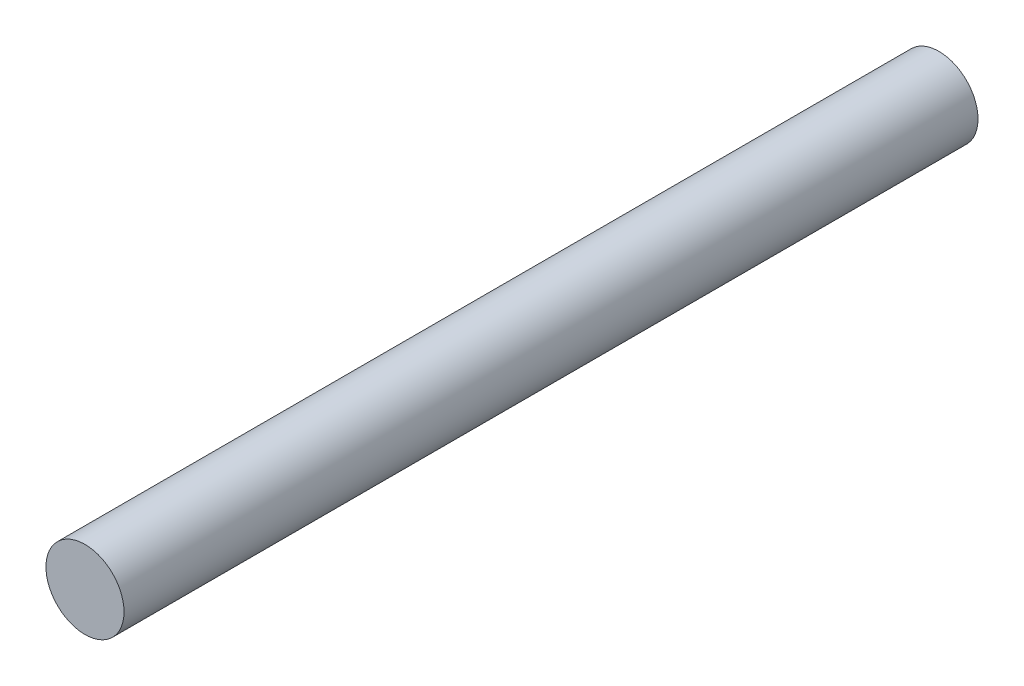
ISO-10303-21;
HEADER;
FILE_DESCRIPTION(('STEP AP214'),'2;1');
FILE_NAME('part.step','',(''),(''),'','','');
FILE_SCHEMA(('AUTOMOTIVE_DESIGN { 1 0 10303 214 1 1 1 1 }'));
ENDSEC;
DATA;
#1=APPLICATION_CONTEXT('core data for automotive mechanical design processes');
#2=APPLICATION_PROTOCOL_DEFINITION('international standard','automotive_design',2000,#1);
#3=PRODUCT_CONTEXT('',#1,'mechanical');
#4=PRODUCT('Part','Part','',(#3));
#5=PRODUCT_RELATED_PRODUCT_CATEGORY('part','',(#4));
#6=PRODUCT_DEFINITION_FORMATION('','',#4);
#7=PRODUCT_DEFINITION_CONTEXT('part definition',#1,'design');
#8=PRODUCT_DEFINITION('design','',#6,#7);
#9=PRODUCT_DEFINITION_SHAPE('','',#8);
#10=(LENGTH_UNIT() NAMED_UNIT(*) SI_UNIT(.MILLI.,.METRE.));
#11=(NAMED_UNIT(*) PLANE_ANGLE_UNIT() SI_UNIT($,.RADIAN.));
#12=(NAMED_UNIT(*) SI_UNIT($,.STERADIAN.) SOLID_ANGLE_UNIT());
#13=UNCERTAINTY_MEASURE_WITH_UNIT(LENGTH_MEASURE(1.E-05),#10,'distance_accuracy_value','');
#14=(GEOMETRIC_REPRESENTATION_CONTEXT(3) GLOBAL_UNCERTAINTY_ASSIGNED_CONTEXT((#13)) GLOBAL_UNIT_ASSIGNED_CONTEXT((#10,
#11,#12)) REPRESENTATION_CONTEXT('',''));
#15=CARTESIAN_POINT('',(0.,0.,0.));
#16=DIRECTION('',(0.,0.,1.));
#17=DIRECTION('',(1.,0.,0.));
#18=AXIS2_PLACEMENT_3D('',#15,#16,#17);
#19=CARTESIAN_POINT('',(0.,0.,-32.8));
#20=DIRECTION('',(0.,0.,1.));
#21=DIRECTION('',(1.,0.,0.));
#22=AXIS2_PLACEMENT_3D('',#19,#20,#21);
#23=CYLINDRICAL_SURFACE('',#22,1.5);
#24=CARTESIAN_POINT('',(0.,0.,-32.8));
#25=DIRECTION('',(0.,0.,1.));
#26=DIRECTION('',(1.,0.,0.));
#27=AXIS2_PLACEMENT_3D('',#24,#25,#26);
#28=CIRCLE('',#27,1.5);
#29=CARTESIAN_POINT('',(1.5,0.,-32.8));
#30=VERTEX_POINT('',#29);
#31=EDGE_CURVE('E10',#30,#30,#28,.T.);
#32=ORIENTED_EDGE('',*,*,#31,.T.);
#33=EDGE_LOOP('',(#32));
#34=FACE_BOUND('',#33,.T.);
#35=CARTESIAN_POINT('',(0.,0.,0.));
#36=DIRECTION('',(0.,0.,1.));
#37=DIRECTION('',(1.,0.,0.));
#38=AXIS2_PLACEMENT_3D('',#35,#36,#37);
#39=CIRCLE('',#38,1.5);
#40=CARTESIAN_POINT('',(1.5,0.,0.));
#41=VERTEX_POINT('',#40);
#42=EDGE_CURVE('E40',#41,#41,#39,.T.);
#43=ORIENTED_EDGE('',*,*,#42,.F.);
#44=EDGE_LOOP('',(#43));
#45=FACE_BOUND('',#44,.T.);
#46=ADVANCED_FACE('F37',(#34,#45),#23,.T.);
#47=CARTESIAN_POINT('',(0.,0.,-32.8));
#48=DIRECTION('',(0.,0.,1.));
#49=DIRECTION('',(1.,0.,0.));
#50=AXIS2_PLACEMENT_3D('',#47,#48,#49);
#51=PLANE('',#50);
#52=ORIENTED_EDGE('',*,*,#31,.F.);
#53=EDGE_LOOP('',(#52));
#54=FACE_BOUND('',#53,.T.);
#55=ADVANCED_FACE('F54',(#54),#51,.F.);
#56=CARTESIAN_POINT('',(0.,0.,0.));
#57=DIRECTION('',(0.,0.,1.));
#58=DIRECTION('',(1.,0.,0.));
#59=AXIS2_PLACEMENT_3D('',#56,#57,#58);
#60=PLANE('',#59);
#61=ORIENTED_EDGE('',*,*,#42,.T.);
#62=EDGE_LOOP('',(#61));
#63=FACE_BOUND('',#62,.T.);
#64=ADVANCED_FACE('F51',(#63),#60,.T.);
#65=CLOSED_SHELL('',(#46,#55,#64));
#66=MANIFOLD_SOLID_BREP('B2',#65);
#67=ADVANCED_BREP_SHAPE_REPRESENTATION('',(#18,#66),#14);
#68=SHAPE_DEFINITION_REPRESENTATION(#9,#67);
ENDSEC;
END-ISO-10303-21;
